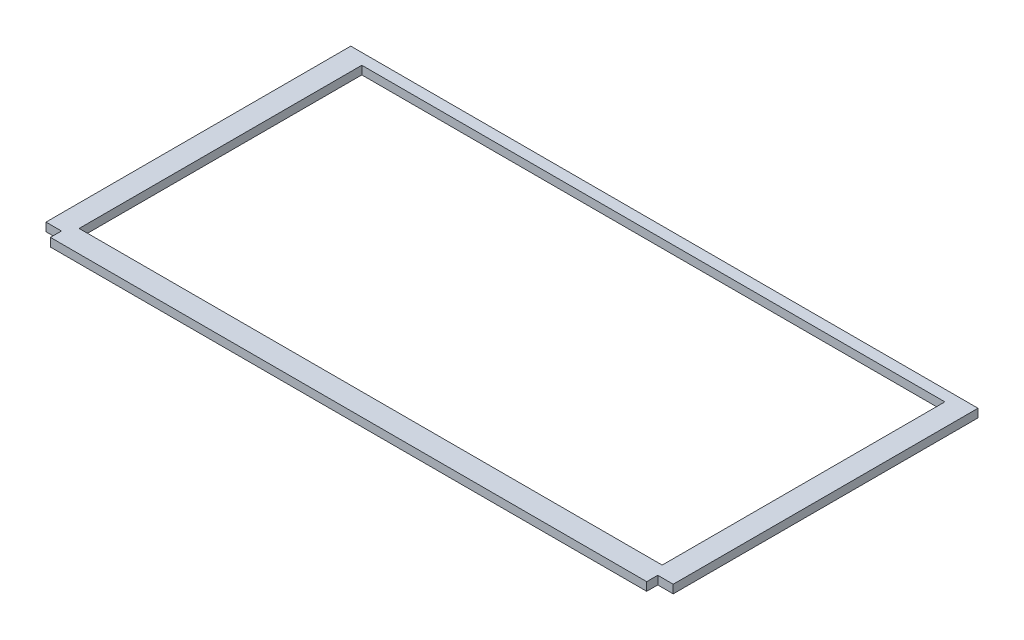
ISO-10303-21;
HEADER;
FILE_DESCRIPTION(('STEP AP214'),'2;1');
FILE_NAME('part.step','',(''),(''),'','','');
FILE_SCHEMA(('AUTOMOTIVE_DESIGN { 1 0 10303 214 1 1 1 1 }'));
ENDSEC;
DATA;
#1=APPLICATION_CONTEXT('core data for automotive mechanical design processes');
#2=APPLICATION_PROTOCOL_DEFINITION('international standard','automotive_design',2000,#1);
#3=PRODUCT_CONTEXT('',#1,'mechanical');
#4=PRODUCT('Part','Part','',(#3));
#5=PRODUCT_RELATED_PRODUCT_CATEGORY('part','',(#4));
#6=PRODUCT_DEFINITION_FORMATION('','',#4);
#7=PRODUCT_DEFINITION_CONTEXT('part definition',#1,'design');
#8=PRODUCT_DEFINITION('design','',#6,#7);
#9=PRODUCT_DEFINITION_SHAPE('','',#8);
#10=(LENGTH_UNIT() NAMED_UNIT(*) SI_UNIT(.MILLI.,.METRE.));
#11=(NAMED_UNIT(*) PLANE_ANGLE_UNIT() SI_UNIT($,.RADIAN.));
#12=(NAMED_UNIT(*) SI_UNIT($,.STERADIAN.) SOLID_ANGLE_UNIT());
#13=UNCERTAINTY_MEASURE_WITH_UNIT(LENGTH_MEASURE(1.E-05),#10,'distance_accuracy_value','');
#14=(GEOMETRIC_REPRESENTATION_CONTEXT(3) GLOBAL_UNCERTAINTY_ASSIGNED_CONTEXT((#13)) GLOBAL_UNIT_ASSIGNED_CONTEXT((#10,
#11,#12)) REPRESENTATION_CONTEXT('',''));
#15=CARTESIAN_POINT('',(0.,0.,0.));
#16=DIRECTION('',(0.,0.,1.));
#17=DIRECTION('',(1.,0.,0.));
#18=AXIS2_PLACEMENT_3D('',#15,#16,#17);
#19=CARTESIAN_POINT('',(0.,1.9,0.));
#20=DIRECTION('',(0.,0.,-1.));
#21=DIRECTION('',(-1.,0.,0.));
#22=AXIS2_PLACEMENT_3D('',#19,#20,#21);
#23=PLANE('',#22);
#24=DIRECTION('',(0.,1.,0.));
#25=VECTOR('',#24,1.);
#26=CARTESIAN_POINT('',(138.5,-135.023146163908,0.));
#27=LINE('',#26,#25);
#28=CARTESIAN_POINT('',(138.5,0.,0.));
#29=VERTEX_POINT('',#28);
#30=CARTESIAN_POINT('',(138.5,1.9,0.));
#31=VERTEX_POINT('',#30);
#32=EDGE_CURVE('E181',#29,#31,#27,.T.);
#33=ORIENTED_EDGE('',*,*,#32,.F.);
#34=DIRECTION('',(1.,0.,0.));
#35=VECTOR('',#34,1.);
#36=CARTESIAN_POINT('',(0.,0.,0.));
#37=LINE('',#36,#35);
#38=CARTESIAN_POINT('',(142.,0.,0.));
#39=VERTEX_POINT('',#38);
#40=EDGE_CURVE('E203',#29,#39,#37,.T.);
#41=ORIENTED_EDGE('',*,*,#40,.T.);
#42=DIRECTION('',(0.,-1.,0.));
#43=VECTOR('',#42,1.);
#44=CARTESIAN_POINT('',(142.,1.9,0.));
#45=LINE('',#44,#43);
#46=CARTESIAN_POINT('',(142.,1.9,0.));
#47=VERTEX_POINT('',#46);
#48=EDGE_CURVE('E44',#47,#39,#45,.T.);
#49=ORIENTED_EDGE('',*,*,#48,.F.);
#50=DIRECTION('',(1.,0.,0.));
#51=VECTOR('',#50,1.);
#52=CARTESIAN_POINT('',(0.,1.9,0.));
#53=LINE('',#52,#51);
#54=EDGE_CURVE('E191',#31,#47,#53,.T.);
#55=ORIENTED_EDGE('',*,*,#54,.F.);
#56=EDGE_LOOP('',(#33,#41,#49,#55));
#57=FACE_BOUND('',#56,.T.);
#58=ADVANCED_FACE('F36',(#57),#23,.F.);
#59=CARTESIAN_POINT('',(0.,1.9,0.));
#60=DIRECTION('',(1.,0.,0.));
#61=DIRECTION('',(0.,0.,-1.));
#62=AXIS2_PLACEMENT_3D('',#59,#60,#61);
#63=PLANE('',#62);
#64=DIRECTION('',(0.,0.,1.));
#65=VECTOR('',#64,1.);
#66=CARTESIAN_POINT('',(0.,0.,0.));
#67=LINE('',#66,#65);
#68=CARTESIAN_POINT('',(0.,0.,-69.));
#69=VERTEX_POINT('',#68);
#70=CARTESIAN_POINT('',(0.,0.,0.));
#71=VERTEX_POINT('',#70);
#72=EDGE_CURVE('E187',#69,#71,#67,.T.);
#73=ORIENTED_EDGE('',*,*,#72,.T.);
#74=DIRECTION('',(0.,-1.,0.));
#75=VECTOR('',#74,1.);
#76=CARTESIAN_POINT('',(0.,1.9,0.));
#77=LINE('',#76,#75);
#78=CARTESIAN_POINT('',(0.,1.9,0.));
#79=VERTEX_POINT('',#78);
#80=EDGE_CURVE('E11',#79,#71,#77,.T.);
#81=ORIENTED_EDGE('',*,*,#80,.F.);
#82=DIRECTION('',(0.,0.,1.));
#83=VECTOR('',#82,1.);
#84=CARTESIAN_POINT('',(0.,1.9,0.));
#85=LINE('',#84,#83);
#86=CARTESIAN_POINT('',(0.,1.9,-69.));
#87=VERTEX_POINT('',#86);
#88=EDGE_CURVE('E188',#87,#79,#85,.T.);
#89=ORIENTED_EDGE('',*,*,#88,.F.);
#90=DIRECTION('',(0.,-1.,0.));
#91=VECTOR('',#90,1.);
#92=CARTESIAN_POINT('',(0.,1.9,-69.));
#93=LINE('',#92,#91);
#94=EDGE_CURVE('E200',#87,#69,#93,.T.);
#95=ORIENTED_EDGE('',*,*,#94,.T.);
#96=EDGE_LOOP('',(#73,#81,#89,#95));
#97=FACE_BOUND('',#96,.T.);
#98=ADVANCED_FACE('F38',(#97),#63,.F.);
#99=CARTESIAN_POINT('',(3.5,0.,0.));
#100=VERTEX_POINT('',#99);
#101=EDGE_CURVE('E204',#71,#100,#37,.T.);
#102=ORIENTED_EDGE('',*,*,#101,.T.);
#103=DIRECTION('',(0.,1.,0.));
#104=VECTOR('',#103,1.);
#105=CARTESIAN_POINT('',(3.5,-135.023146163908,0.));
#106=LINE('',#105,#104);
#107=CARTESIAN_POINT('',(3.5,1.9,0.));
#108=VERTEX_POINT('',#107);
#109=EDGE_CURVE('E178',#100,#108,#106,.T.);
#110=ORIENTED_EDGE('',*,*,#109,.T.);
#111=EDGE_CURVE('E193',#79,#108,#53,.T.);
#112=ORIENTED_EDGE('',*,*,#111,.F.);
#113=ORIENTED_EDGE('',*,*,#80,.T.);
#114=EDGE_LOOP('',(#102,#110,#112,#113));
#115=FACE_BOUND('',#114,.T.);
#116=ADVANCED_FACE('F248',(#115),#23,.F.);
#117=CARTESIAN_POINT('',(142.,1.9,0.));
#118=DIRECTION('',(-1.,0.,0.));
#119=DIRECTION('',(0.,0.,1.));
#120=AXIS2_PLACEMENT_3D('',#117,#118,#119);
#121=PLANE('',#120);
#122=DIRECTION('',(0.,0.,-1.));
#123=VECTOR('',#122,1.);
#124=CARTESIAN_POINT('',(142.,0.,0.));
#125=LINE('',#124,#123);
#126=CARTESIAN_POINT('',(142.,0.,-69.));
#127=VERTEX_POINT('',#126);
#128=EDGE_CURVE('E207',#39,#127,#125,.T.);
#129=ORIENTED_EDGE('',*,*,#128,.T.);
#130=DIRECTION('',(0.,-1.,0.));
#131=VECTOR('',#130,1.);
#132=CARTESIAN_POINT('',(142.,1.9,-69.));
#133=LINE('',#132,#131);
#134=CARTESIAN_POINT('',(142.,1.9,-69.));
#135=VERTEX_POINT('',#134);
#136=EDGE_CURVE('E212',#135,#127,#133,.T.);
#137=ORIENTED_EDGE('',*,*,#136,.F.);
#138=DIRECTION('',(0.,0.,-1.));
#139=VECTOR('',#138,1.);
#140=CARTESIAN_POINT('',(142.,1.9,0.));
#141=LINE('',#140,#139);
#142=EDGE_CURVE('E196',#47,#135,#141,.T.);
#143=ORIENTED_EDGE('',*,*,#142,.F.);
#144=ORIENTED_EDGE('',*,*,#48,.T.);
#145=EDGE_LOOP('',(#129,#137,#143,#144));
#146=FACE_BOUND('',#145,.T.);
#147=ADVANCED_FACE('F219',(#146),#121,.F.);
#148=CARTESIAN_POINT('',(0.,1.9,-69.));
#149=DIRECTION('',(0.,0.,1.));
#150=DIRECTION('',(1.,0.,0.));
#151=AXIS2_PLACEMENT_3D('',#148,#149,#150);
#152=PLANE('',#151);
#153=DIRECTION('',(-1.,0.,0.));
#154=VECTOR('',#153,1.);
#155=CARTESIAN_POINT('',(0.,0.,-69.));
#156=LINE('',#155,#154);
#157=EDGE_CURVE('E192',#127,#69,#156,.T.);
#158=ORIENTED_EDGE('',*,*,#157,.T.);
#159=ORIENTED_EDGE('',*,*,#94,.F.);
#160=DIRECTION('',(-1.,0.,0.));
#161=VECTOR('',#160,1.);
#162=CARTESIAN_POINT('',(0.,1.9,-69.));
#163=LINE('',#162,#161);
#164=EDGE_CURVE('E198',#135,#87,#163,.T.);
#165=ORIENTED_EDGE('',*,*,#164,.F.);
#166=ORIENTED_EDGE('',*,*,#136,.T.);
#167=EDGE_LOOP('',(#158,#159,#165,#166));
#168=FACE_BOUND('',#167,.T.);
#169=ADVANCED_FACE('F230',(#168),#152,.F.);
#170=CARTESIAN_POINT('',(0.,1.9,0.));
#171=DIRECTION('',(0.,-1.,0.));
#172=DIRECTION('',(0.,0.,-1.));
#173=AXIS2_PLACEMENT_3D('',#170,#171,#172);
#174=PLANE('',#173);
#175=DIRECTION('',(-1.,0.,0.));
#176=VECTOR('',#175,1.);
#177=CARTESIAN_POINT('',(137.,1.9,-2.5));
#178=LINE('',#177,#176);
#179=CARTESIAN_POINT('',(137.,1.9,-2.5));
#180=VERTEX_POINT('',#179);
#181=CARTESIAN_POINT('',(5.,1.9,-2.50000000000002));
#182=VERTEX_POINT('',#181);
#183=EDGE_CURVE('E133',#180,#182,#178,.T.);
#184=ORIENTED_EDGE('',*,*,#183,.T.);
#185=DIRECTION('',(0.,0.,-1.));
#186=VECTOR('',#185,1.);
#187=CARTESIAN_POINT('',(5.,1.9,-2.50000000000002));
#188=LINE('',#187,#186);
#189=CARTESIAN_POINT('',(5.,1.9,-66.5));
#190=VERTEX_POINT('',#189);
#191=EDGE_CURVE('E127',#182,#190,#188,.T.);
#192=ORIENTED_EDGE('',*,*,#191,.T.);
#193=DIRECTION('',(1.,0.,0.));
#194=VECTOR('',#193,1.);
#195=CARTESIAN_POINT('',(137.,1.9,-66.5));
#196=LINE('',#195,#194);
#197=CARTESIAN_POINT('',(137.,1.9,-66.5));
#198=VERTEX_POINT('',#197);
#199=EDGE_CURVE('E136',#190,#198,#196,.T.);
#200=ORIENTED_EDGE('',*,*,#199,.T.);
#201=DIRECTION('',(0.,0.,1.));
#202=VECTOR('',#201,1.);
#203=CARTESIAN_POINT('',(137.,1.9,-2.5));
#204=LINE('',#203,#202);
#205=EDGE_CURVE('E51',#198,#180,#204,.T.);
#206=ORIENTED_EDGE('',*,*,#205,.T.);
#207=EDGE_LOOP('',(#184,#192,#200,#206));
#208=FACE_BOUND('',#207,.T.);
#209=ORIENTED_EDGE('',*,*,#88,.T.);
#210=ORIENTED_EDGE('',*,*,#111,.T.);
#211=DIRECTION('',(0.,0.,1.));
#212=VECTOR('',#211,1.);
#213=CARTESIAN_POINT('',(3.5,1.9,0.));
#214=LINE('',#213,#212);
#215=CARTESIAN_POINT('',(3.5,1.9,2.49999999999999));
#216=VERTEX_POINT('',#215);
#217=EDGE_CURVE('E158',#108,#216,#214,.T.);
#218=ORIENTED_EDGE('',*,*,#217,.T.);
#219=DIRECTION('',(1.,0.,0.));
#220=VECTOR('',#219,1.);
#221=CARTESIAN_POINT('',(3.5,1.9,2.49999999999999));
#222=LINE('',#221,#220);
#223=CARTESIAN_POINT('',(138.5,1.9,2.49999999999999));
#224=VERTEX_POINT('',#223);
#225=EDGE_CURVE('E166',#216,#224,#222,.T.);
#226=ORIENTED_EDGE('',*,*,#225,.T.);
#227=DIRECTION('',(0.,0.,-1.));
#228=VECTOR('',#227,1.);
#229=CARTESIAN_POINT('',(138.5,1.9,0.));
#230=LINE('',#229,#228);
#231=EDGE_CURVE('E162',#224,#31,#230,.T.);
#232=ORIENTED_EDGE('',*,*,#231,.T.);
#233=ORIENTED_EDGE('',*,*,#54,.T.);
#234=ORIENTED_EDGE('',*,*,#142,.T.);
#235=ORIENTED_EDGE('',*,*,#164,.T.);
#236=EDGE_LOOP('',(#209,#210,#218,#226,#232,#233,#234,#235));
#237=FACE_BOUND('',#236,.T.);
#238=ADVANCED_FACE('F140',(#208,#237),#174,.F.);
#239=CARTESIAN_POINT('',(0.,0.,0.));
#240=DIRECTION('',(0.,-1.,0.));
#241=DIRECTION('',(0.,0.,-1.));
#242=AXIS2_PLACEMENT_3D('',#239,#240,#241);
#243=PLANE('',#242);
#244=DIRECTION('',(0.,0.,-1.));
#245=VECTOR('',#244,1.);
#246=CARTESIAN_POINT('',(5.,0.,-2.50000000000002));
#247=LINE('',#246,#245);
#248=CARTESIAN_POINT('',(5.,0.,-2.50000000000002));
#249=VERTEX_POINT('',#248);
#250=CARTESIAN_POINT('',(5.,0.,-66.5));
#251=VERTEX_POINT('',#250);
#252=EDGE_CURVE('E59',#249,#251,#247,.T.);
#253=ORIENTED_EDGE('',*,*,#252,.F.);
#254=DIRECTION('',(-1.,0.,0.));
#255=VECTOR('',#254,1.);
#256=CARTESIAN_POINT('',(137.,0.,-2.5));
#257=LINE('',#256,#255);
#258=CARTESIAN_POINT('',(137.,0.,-2.5));
#259=VERTEX_POINT('',#258);
#260=EDGE_CURVE('E143',#259,#249,#257,.T.);
#261=ORIENTED_EDGE('',*,*,#260,.F.);
#262=DIRECTION('',(0.,0.,1.));
#263=VECTOR('',#262,1.);
#264=CARTESIAN_POINT('',(137.,0.,-2.5));
#265=LINE('',#264,#263);
#266=CARTESIAN_POINT('',(137.,0.,-66.5));
#267=VERTEX_POINT('',#266);
#268=EDGE_CURVE('E146',#267,#259,#265,.T.);
#269=ORIENTED_EDGE('',*,*,#268,.F.);
#270=DIRECTION('',(1.,0.,0.));
#271=VECTOR('',#270,1.);
#272=CARTESIAN_POINT('',(137.,0.,-66.5));
#273=LINE('',#272,#271);
#274=EDGE_CURVE('E152',#251,#267,#273,.T.);
#275=ORIENTED_EDGE('',*,*,#274,.F.);
#276=EDGE_LOOP('',(#253,#261,#269,#275));
#277=FACE_BOUND('',#276,.T.);
#278=ORIENTED_EDGE('',*,*,#72,.F.);
#279=ORIENTED_EDGE('',*,*,#157,.F.);
#280=ORIENTED_EDGE('',*,*,#128,.F.);
#281=ORIENTED_EDGE('',*,*,#40,.F.);
#282=DIRECTION('',(0.,0.,-1.));
#283=VECTOR('',#282,1.);
#284=CARTESIAN_POINT('',(138.5,0.,0.));
#285=LINE('',#284,#283);
#286=CARTESIAN_POINT('',(138.5,0.,2.49999999999999));
#287=VERTEX_POINT('',#286);
#288=EDGE_CURVE('E179',#287,#29,#285,.T.);
#289=ORIENTED_EDGE('',*,*,#288,.F.);
#290=DIRECTION('',(1.,0.,0.));
#291=VECTOR('',#290,1.);
#292=CARTESIAN_POINT('',(3.5,0.,2.49999999999999));
#293=LINE('',#292,#291);
#294=CARTESIAN_POINT('',(3.5,0.,2.49999999999999));
#295=VERTEX_POINT('',#294);
#296=EDGE_CURVE('E165',#295,#287,#293,.T.);
#297=ORIENTED_EDGE('',*,*,#296,.F.);
#298=DIRECTION('',(0.,0.,1.));
#299=VECTOR('',#298,1.);
#300=CARTESIAN_POINT('',(3.5,0.,0.));
#301=LINE('',#300,#299);
#302=EDGE_CURVE('E174',#100,#295,#301,.T.);
#303=ORIENTED_EDGE('',*,*,#302,.F.);
#304=ORIENTED_EDGE('',*,*,#101,.F.);
#305=EDGE_LOOP('',(#278,#279,#280,#281,#289,#297,#303,#304));
#306=FACE_BOUND('',#305,.T.);
#307=ADVANCED_FACE('F227',(#277,#306),#243,.T.);
#308=CARTESIAN_POINT('',(3.5,-135.023146163908,2.49999999999999));
#309=DIRECTION('',(0.,0.,1.));
#310=DIRECTION('',(1.,0.,0.));
#311=AXIS2_PLACEMENT_3D('',#308,#309,#310);
#312=PLANE('',#311);
#313=DIRECTION('',(0.,1.,0.));
#314=VECTOR('',#313,1.);
#315=CARTESIAN_POINT('',(3.5,-135.023146163908,2.49999999999999));
#316=LINE('',#315,#314);
#317=EDGE_CURVE('E177',#295,#216,#316,.T.);
#318=ORIENTED_EDGE('',*,*,#317,.F.);
#319=ORIENTED_EDGE('',*,*,#296,.T.);
#320=DIRECTION('',(0.,1.,0.));
#321=VECTOR('',#320,1.);
#322=CARTESIAN_POINT('',(138.5,-135.023146163908,2.49999999999999));
#323=LINE('',#322,#321);
#324=EDGE_CURVE('E173',#287,#224,#323,.T.);
#325=ORIENTED_EDGE('',*,*,#324,.T.);
#326=ORIENTED_EDGE('',*,*,#225,.F.);
#327=EDGE_LOOP('',(#318,#319,#325,#326));
#328=FACE_BOUND('',#327,.T.);
#329=ADVANCED_FACE('F246',(#328),#312,.T.);
#330=CARTESIAN_POINT('',(138.5,-135.023146163908,0.));
#331=DIRECTION('',(1.,0.,0.));
#332=DIRECTION('',(0.,0.,-1.));
#333=AXIS2_PLACEMENT_3D('',#330,#331,#332);
#334=PLANE('',#333);
#335=ORIENTED_EDGE('',*,*,#324,.F.);
#336=ORIENTED_EDGE('',*,*,#288,.T.);
#337=ORIENTED_EDGE('',*,*,#32,.T.);
#338=ORIENTED_EDGE('',*,*,#231,.F.);
#339=EDGE_LOOP('',(#335,#336,#337,#338));
#340=FACE_BOUND('',#339,.T.);
#341=ADVANCED_FACE('F239',(#340),#334,.T.);
#342=CARTESIAN_POINT('',(3.5,-135.023146163908,0.));
#343=DIRECTION('',(-1.,0.,0.));
#344=DIRECTION('',(0.,0.,1.));
#345=AXIS2_PLACEMENT_3D('',#342,#343,#344);
#346=PLANE('',#345);
#347=ORIENTED_EDGE('',*,*,#109,.F.);
#348=ORIENTED_EDGE('',*,*,#302,.T.);
#349=ORIENTED_EDGE('',*,*,#317,.T.);
#350=ORIENTED_EDGE('',*,*,#217,.F.);
#351=EDGE_LOOP('',(#347,#348,#349,#350));
#352=FACE_BOUND('',#351,.T.);
#353=ADVANCED_FACE('F244',(#352),#346,.T.);
#354=CARTESIAN_POINT('',(5.,1.9,-2.50000000000002));
#355=DIRECTION('',(-1.,0.,0.));
#356=DIRECTION('',(0.,0.,1.));
#357=AXIS2_PLACEMENT_3D('',#354,#355,#356);
#358=PLANE('',#357);
#359=ORIENTED_EDGE('',*,*,#252,.T.);
#360=DIRECTION('',(0.,-1.,0.));
#361=VECTOR('',#360,1.);
#362=CARTESIAN_POINT('',(5.,1.9,-66.5));
#363=LINE('',#362,#361);
#364=EDGE_CURVE('E123',#190,#251,#363,.T.);
#365=ORIENTED_EDGE('',*,*,#364,.F.);
#366=ORIENTED_EDGE('',*,*,#191,.F.);
#367=DIRECTION('',(0.,-1.,0.));
#368=VECTOR('',#367,1.);
#369=CARTESIAN_POINT('',(5.,1.9,-2.50000000000002));
#370=LINE('',#369,#368);
#371=EDGE_CURVE('E156',#182,#249,#370,.T.);
#372=ORIENTED_EDGE('',*,*,#371,.T.);
#373=EDGE_LOOP('',(#359,#365,#366,#372));
#374=FACE_BOUND('',#373,.T.);
#375=ADVANCED_FACE('F125',(#374),#358,.F.);
#376=CARTESIAN_POINT('',(137.,1.9,-2.5));
#377=DIRECTION('',(0.,0.,1.));
#378=DIRECTION('',(1.,0.,0.));
#379=AXIS2_PLACEMENT_3D('',#376,#377,#378);
#380=PLANE('',#379);
#381=ORIENTED_EDGE('',*,*,#260,.T.);
#382=ORIENTED_EDGE('',*,*,#371,.F.);
#383=ORIENTED_EDGE('',*,*,#183,.F.);
#384=DIRECTION('',(0.,-1.,0.));
#385=VECTOR('',#384,1.);
#386=CARTESIAN_POINT('',(137.,1.9,-2.5));
#387=LINE('',#386,#385);
#388=EDGE_CURVE('E159',#180,#259,#387,.T.);
#389=ORIENTED_EDGE('',*,*,#388,.T.);
#390=EDGE_LOOP('',(#381,#382,#383,#389));
#391=FACE_BOUND('',#390,.T.);
#392=ADVANCED_FACE('F320',(#391),#380,.F.);
#393=CARTESIAN_POINT('',(137.,1.9,-2.5));
#394=DIRECTION('',(1.,0.,0.));
#395=DIRECTION('',(0.,0.,-1.));
#396=AXIS2_PLACEMENT_3D('',#393,#394,#395);
#397=PLANE('',#396);
#398=ORIENTED_EDGE('',*,*,#268,.T.);
#399=ORIENTED_EDGE('',*,*,#388,.F.);
#400=ORIENTED_EDGE('',*,*,#205,.F.);
#401=DIRECTION('',(0.,-1.,0.));
#402=VECTOR('',#401,1.);
#403=CARTESIAN_POINT('',(137.,1.9,-66.5));
#404=LINE('',#403,#402);
#405=EDGE_CURVE('E132',#198,#267,#404,.T.);
#406=ORIENTED_EDGE('',*,*,#405,.T.);
#407=EDGE_LOOP('',(#398,#399,#400,#406));
#408=FACE_BOUND('',#407,.T.);
#409=ADVANCED_FACE('F327',(#408),#397,.F.);
#410=CARTESIAN_POINT('',(137.,1.9,-66.5));
#411=DIRECTION('',(0.,0.,-1.));
#412=DIRECTION('',(-1.,0.,0.));
#413=AXIS2_PLACEMENT_3D('',#410,#411,#412);
#414=PLANE('',#413);
#415=ORIENTED_EDGE('',*,*,#274,.T.);
#416=ORIENTED_EDGE('',*,*,#405,.F.);
#417=ORIENTED_EDGE('',*,*,#199,.F.);
#418=ORIENTED_EDGE('',*,*,#364,.T.);
#419=EDGE_LOOP('',(#415,#416,#417,#418));
#420=FACE_BOUND('',#419,.T.);
#421=ADVANCED_FACE('F137',(#420),#414,.F.);
#422=CLOSED_SHELL('',(#58,#98,#116,#147,#169,#238,#307,#329,#341,#353,#375,#392,#409,#421));
#423=MANIFOLD_SOLID_BREP('B2',#422);
#424=ADVANCED_BREP_SHAPE_REPRESENTATION('',(#18,#423),#14);
#425=SHAPE_DEFINITION_REPRESENTATION(#9,#424);
ENDSEC;
END-ISO-10303-21;
